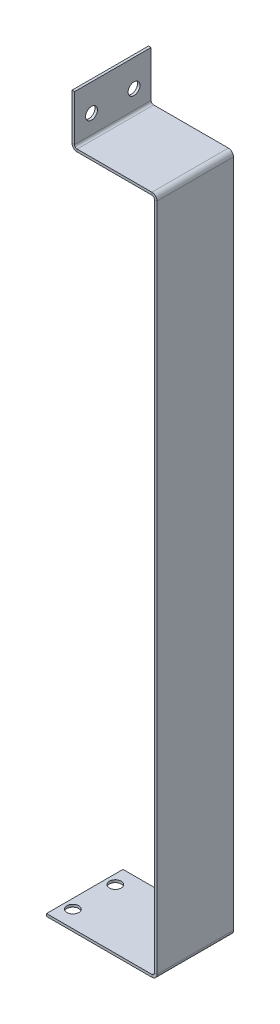
ISO-10303-21;
HEADER;
FILE_DESCRIPTION(('STEP AP214'),'2;1');
FILE_NAME('part.step','',(''),(''),'','','');
FILE_SCHEMA(('AUTOMOTIVE_DESIGN { 1 0 10303 214 1 1 1 1 }'));
ENDSEC;
DATA;
#1=APPLICATION_CONTEXT('core data for automotive mechanical design processes');
#2=APPLICATION_PROTOCOL_DEFINITION('international standard','automotive_design',2000,#1);
#3=PRODUCT_CONTEXT('',#1,'mechanical');
#4=PRODUCT('Part','Part','',(#3));
#5=PRODUCT_RELATED_PRODUCT_CATEGORY('part','',(#4));
#6=PRODUCT_DEFINITION_FORMATION('','',#4);
#7=PRODUCT_DEFINITION_CONTEXT('part definition',#1,'design');
#8=PRODUCT_DEFINITION('design','',#6,#7);
#9=PRODUCT_DEFINITION_SHAPE('','',#8);
#10=(LENGTH_UNIT() NAMED_UNIT(*) SI_UNIT(.MILLI.,.METRE.));
#11=(NAMED_UNIT(*) PLANE_ANGLE_UNIT() SI_UNIT($,.RADIAN.));
#12=(NAMED_UNIT(*) SI_UNIT($,.STERADIAN.) SOLID_ANGLE_UNIT());
#13=UNCERTAINTY_MEASURE_WITH_UNIT(LENGTH_MEASURE(1.E-05),#10,'distance_accuracy_value','');
#14=(GEOMETRIC_REPRESENTATION_CONTEXT(3) GLOBAL_UNCERTAINTY_ASSIGNED_CONTEXT((#13)) GLOBAL_UNIT_ASSIGNED_CONTEXT((#10,
#11,#12)) REPRESENTATION_CONTEXT('',''));
#15=CARTESIAN_POINT('',(0.,0.,0.));
#16=DIRECTION('',(0.,0.,1.));
#17=DIRECTION('',(1.,0.,0.));
#18=AXIS2_PLACEMENT_3D('',#15,#16,#17);
#19=CARTESIAN_POINT('',(-48.5,401.5,-45.));
#20=DIRECTION('',(0.,0.,-1.));
#21=DIRECTION('',(-1.,0.,0.));
#22=AXIS2_PLACEMENT_3D('',#19,#20,#21);
#23=PLANE('',#22);
#24=DIRECTION('',(-1.,0.,0.));
#25=VECTOR('',#24,1.);
#26=CARTESIAN_POINT('',(-48.5,401.5,-45.));
#27=LINE('',#26,#25);
#28=CARTESIAN_POINT('',(-48.5,401.5,-45.));
#29=VERTEX_POINT('',#28);
#30=CARTESIAN_POINT('',(-50.,401.5,-45.));
#31=VERTEX_POINT('',#30);
#32=EDGE_CURVE('E11',#29,#31,#27,.T.);
#33=ORIENTED_EDGE('',*,*,#32,.F.);
#34=CARTESIAN_POINT('',(-47.,401.5,-45.));
#35=DIRECTION('',(0.,0.,-1.));
#36=DIRECTION('',(-1.,0.,0.));
#37=AXIS2_PLACEMENT_3D('',#34,#35,#36);
#38=CIRCLE('',#37,1.5);
#39=CARTESIAN_POINT('',(-47.,400.,-45.));
#40=VERTEX_POINT('',#39);
#41=EDGE_CURVE('E347',#29,#40,#38,.F.);
#42=ORIENTED_EDGE('',*,*,#41,.T.);
#43=DIRECTION('',(0.,1.,0.));
#44=VECTOR('',#43,1.);
#45=CARTESIAN_POINT('',(-47.,398.5,-45.));
#46=LINE('',#45,#44);
#47=CARTESIAN_POINT('',(-47.,398.5,-45.));
#48=VERTEX_POINT('',#47);
#49=EDGE_CURVE('E54',#48,#40,#46,.T.);
#50=ORIENTED_EDGE('',*,*,#49,.F.);
#51=CARTESIAN_POINT('',(-47.,401.5,-45.));
#52=DIRECTION('',(0.,0.,1.));
#53=DIRECTION('',(1.,0.,0.));
#54=AXIS2_PLACEMENT_3D('',#51,#52,#53);
#55=CIRCLE('',#54,3.);
#56=EDGE_CURVE('E210',#31,#48,#55,.T.);
#57=ORIENTED_EDGE('',*,*,#56,.F.);
#58=EDGE_LOOP('',(#33,#42,#50,#57));
#59=FACE_BOUND('',#58,.T.);
#60=ADVANCED_FACE('F45',(#59),#23,.T.);
#61=CARTESIAN_POINT('',(-47.,398.5,-45.));
#62=DIRECTION('',(0.,0.,-1.));
#63=DIRECTION('',(-1.,0.,0.));
#64=AXIS2_PLACEMENT_3D('',#61,#62,#63);
#65=PLANE('',#64);
#66=DIRECTION('',(0.,-1.,0.));
#67=VECTOR('',#66,1.);
#68=CARTESIAN_POINT('',(-48.5,428.5,-45.));
#69=LINE('',#68,#67);
#70=CARTESIAN_POINT('',(-48.5,428.5,-45.));
#71=VERTEX_POINT('',#70);
#72=EDGE_CURVE('E350',#71,#29,#69,.T.);
#73=ORIENTED_EDGE('',*,*,#72,.T.);
#74=ORIENTED_EDGE('',*,*,#32,.T.);
#75=DIRECTION('',(0.,-1.,0.));
#76=VECTOR('',#75,1.);
#77=CARTESIAN_POINT('',(-50.,428.5,-45.));
#78=LINE('',#77,#76);
#79=CARTESIAN_POINT('',(-50.,428.5,-45.));
#80=VERTEX_POINT('',#79);
#81=EDGE_CURVE('E355',#80,#31,#78,.T.);
#82=ORIENTED_EDGE('',*,*,#81,.F.);
#83=DIRECTION('',(1.,0.,0.));
#84=VECTOR('',#83,1.);
#85=CARTESIAN_POINT('',(-50.,428.5,-45.));
#86=LINE('',#85,#84);
#87=EDGE_CURVE('E353',#80,#71,#86,.T.);
#88=ORIENTED_EDGE('',*,*,#87,.T.);
#89=EDGE_LOOP('',(#73,#74,#82,#88));
#90=FACE_BOUND('',#89,.T.);
#91=ADVANCED_FACE('F372',(#90),#65,.T.);
#92=CARTESIAN_POINT('',(-47.,400.,0.));
#93=DIRECTION('',(0.,0.,1.));
#94=DIRECTION('',(1.,0.,0.));
#95=AXIS2_PLACEMENT_3D('',#92,#93,#94);
#96=PLANE('',#95);
#97=DIRECTION('',(0.,-1.,0.));
#98=VECTOR('',#97,1.);
#99=CARTESIAN_POINT('',(-47.,400.,0.));
#100=LINE('',#99,#98);
#101=CARTESIAN_POINT('',(-47.,400.,0.));
#102=VERTEX_POINT('',#101);
#103=CARTESIAN_POINT('',(-47.,398.5,0.));
#104=VERTEX_POINT('',#103);
#105=EDGE_CURVE('E307',#102,#104,#100,.T.);
#106=ORIENTED_EDGE('',*,*,#105,.F.);
#107=CARTESIAN_POINT('',(-47.,401.5,0.));
#108=DIRECTION('',(0.,0.,-1.));
#109=DIRECTION('',(-1.,0.,0.));
#110=AXIS2_PLACEMENT_3D('',#107,#108,#109);
#111=CIRCLE('',#110,1.5);
#112=CARTESIAN_POINT('',(-48.5,401.5,0.));
#113=VERTEX_POINT('',#112);
#114=EDGE_CURVE('E237',#113,#102,#111,.F.);
#115=ORIENTED_EDGE('',*,*,#114,.F.);
#116=DIRECTION('',(1.,0.,0.));
#117=VECTOR('',#116,1.);
#118=CARTESIAN_POINT('',(-50.,401.5,0.));
#119=LINE('',#118,#117);
#120=CARTESIAN_POINT('',(-50.,401.5,0.));
#121=VERTEX_POINT('',#120);
#122=EDGE_CURVE('E305',#121,#113,#119,.T.);
#123=ORIENTED_EDGE('',*,*,#122,.F.);
#124=CARTESIAN_POINT('',(-47.,401.5,0.));
#125=DIRECTION('',(0.,0.,1.));
#126=DIRECTION('',(1.,0.,0.));
#127=AXIS2_PLACEMENT_3D('',#124,#125,#126);
#128=CIRCLE('',#127,3.);
#129=EDGE_CURVE('E248',#121,#104,#128,.T.);
#130=ORIENTED_EDGE('',*,*,#129,.T.);
#131=EDGE_LOOP('',(#106,#115,#123,#130));
#132=FACE_BOUND('',#131,.T.);
#133=ADVANCED_FACE('F396',(#132),#96,.T.);
#134=CARTESIAN_POINT('',(-50.,401.5,0.));
#135=DIRECTION('',(0.,0.,1.));
#136=DIRECTION('',(1.,0.,0.));
#137=AXIS2_PLACEMENT_3D('',#134,#135,#136);
#138=PLANE('',#137);
#139=DIRECTION('',(1.,0.,0.));
#140=VECTOR('',#139,1.);
#141=CARTESIAN_POINT('',(-48.5,400.,0.));
#142=LINE('',#141,#140);
#143=CARTESIAN_POINT('',(-3.,400.,0.));
#144=VERTEX_POINT('',#143);
#145=EDGE_CURVE('E234',#102,#144,#142,.T.);
#146=ORIENTED_EDGE('',*,*,#145,.F.);
#147=ORIENTED_EDGE('',*,*,#105,.T.);
#148=DIRECTION('',(1.,0.,0.));
#149=VECTOR('',#148,1.);
#150=CARTESIAN_POINT('',(-48.5,398.5,0.));
#151=LINE('',#150,#149);
#152=CARTESIAN_POINT('',(-2.99999999999999,398.5,0.));
#153=VERTEX_POINT('',#152);
#154=EDGE_CURVE('E251',#104,#153,#151,.T.);
#155=ORIENTED_EDGE('',*,*,#154,.T.);
#156=DIRECTION('',(0.,1.,0.));
#157=VECTOR('',#156,1.);
#158=CARTESIAN_POINT('',(-2.99999999999999,398.5,0.));
#159=LINE('',#158,#157);
#160=EDGE_CURVE('E301',#153,#144,#159,.T.);
#161=ORIENTED_EDGE('',*,*,#160,.T.);
#162=EDGE_LOOP('',(#146,#147,#155,#161));
#163=FACE_BOUND('',#162,.T.);
#164=ADVANCED_FACE('F421',(#163),#138,.T.);
#165=CARTESIAN_POINT('',(-3.,400.,-45.));
#166=DIRECTION('',(0.,0.,-1.));
#167=DIRECTION('',(-1.,0.,0.));
#168=AXIS2_PLACEMENT_3D('',#165,#166,#167);
#169=PLANE('',#168);
#170=DIRECTION('',(0.,-1.,0.));
#171=VECTOR('',#170,1.);
#172=CARTESIAN_POINT('',(-3.,400.,-45.));
#173=LINE('',#172,#171);
#174=CARTESIAN_POINT('',(-3.,400.,-45.));
#175=VERTEX_POINT('',#174);
#176=CARTESIAN_POINT('',(-2.99999999999999,398.5,-45.));
#177=VERTEX_POINT('',#176);
#178=EDGE_CURVE('E182',#175,#177,#173,.T.);
#179=ORIENTED_EDGE('',*,*,#178,.F.);
#180=CARTESIAN_POINT('',(-2.99999999999999,397.,-45.));
#181=DIRECTION('',(0.,0.,1.));
#182=DIRECTION('',(1.,0.,0.));
#183=AXIS2_PLACEMENT_3D('',#180,#181,#182);
#184=CIRCLE('',#183,3.);
#185=CARTESIAN_POINT('',(0.,397.,-45.));
#186=VERTEX_POINT('',#185);
#187=EDGE_CURVE('E177',#175,#186,#184,.F.);
#188=ORIENTED_EDGE('',*,*,#187,.T.);
#189=DIRECTION('',(1.,0.,0.));
#190=VECTOR('',#189,1.);
#191=CARTESIAN_POINT('',(-1.49999999999999,397.,-45.));
#192=LINE('',#191,#190);
#193=CARTESIAN_POINT('',(-1.49999999999999,397.,-45.));
#194=VERTEX_POINT('',#193);
#195=EDGE_CURVE('E170',#194,#186,#192,.T.);
#196=ORIENTED_EDGE('',*,*,#195,.F.);
#197=CARTESIAN_POINT('',(-2.99999999999999,397.,-45.));
#198=DIRECTION('',(0.,0.,1.));
#199=DIRECTION('',(1.,0.,0.));
#200=AXIS2_PLACEMENT_3D('',#197,#198,#199);
#201=CIRCLE('',#200,1.5);
#202=EDGE_CURVE('E174',#177,#194,#201,.F.);
#203=ORIENTED_EDGE('',*,*,#202,.F.);
#204=EDGE_LOOP('',(#179,#188,#196,#203));
#205=FACE_BOUND('',#204,.T.);
#206=ADVANCED_FACE('F172',(#205),#169,.T.);
#207=CARTESIAN_POINT('',(-1.49999999999999,397.,-45.));
#208=DIRECTION('',(0.,0.,-1.));
#209=DIRECTION('',(-1.,0.,0.));
#210=AXIS2_PLACEMENT_3D('',#207,#208,#209);
#211=PLANE('',#210);
#212=DIRECTION('',(1.,0.,0.));
#213=VECTOR('',#212,1.);
#214=CARTESIAN_POINT('',(-48.5,400.,-45.));
#215=LINE('',#214,#213);
#216=EDGE_CURVE('E344',#40,#175,#215,.T.);
#217=ORIENTED_EDGE('',*,*,#216,.T.);
#218=ORIENTED_EDGE('',*,*,#178,.T.);
#219=DIRECTION('',(1.,0.,0.));
#220=VECTOR('',#219,1.);
#221=CARTESIAN_POINT('',(-48.5,398.5,-45.));
#222=LINE('',#221,#220);
#223=EDGE_CURVE('E208',#48,#177,#222,.T.);
#224=ORIENTED_EDGE('',*,*,#223,.F.);
#225=ORIENTED_EDGE('',*,*,#49,.T.);
#226=EDGE_LOOP('',(#217,#218,#224,#225));
#227=FACE_BOUND('',#226,.T.);
#228=ADVANCED_FACE('F390',(#227),#211,.T.);
#229=CARTESIAN_POINT('',(0.,397.,0.));
#230=DIRECTION('',(0.,0.,1.));
#231=DIRECTION('',(1.,0.,0.));
#232=AXIS2_PLACEMENT_3D('',#229,#230,#231);
#233=PLANE('',#232);
#234=DIRECTION('',(-1.,0.,0.));
#235=VECTOR('',#234,1.);
#236=CARTESIAN_POINT('',(0.,397.,0.));
#237=LINE('',#236,#235);
#238=CARTESIAN_POINT('',(0.,397.,0.));
#239=VERTEX_POINT('',#238);
#240=CARTESIAN_POINT('',(-1.49999999999999,397.,0.));
#241=VERTEX_POINT('',#240);
#242=EDGE_CURVE('E183',#239,#241,#237,.T.);
#243=ORIENTED_EDGE('',*,*,#242,.F.);
#244=CARTESIAN_POINT('',(-2.99999999999999,397.,0.));
#245=DIRECTION('',(0.,0.,1.));
#246=DIRECTION('',(1.,0.,0.));
#247=AXIS2_PLACEMENT_3D('',#244,#245,#246);
#248=CIRCLE('',#247,3.);
#249=EDGE_CURVE('E231',#144,#239,#248,.F.);
#250=ORIENTED_EDGE('',*,*,#249,.F.);
#251=ORIENTED_EDGE('',*,*,#160,.F.);
#252=CARTESIAN_POINT('',(-2.99999999999999,397.,0.));
#253=DIRECTION('',(0.,0.,1.));
#254=DIRECTION('',(1.,0.,0.));
#255=AXIS2_PLACEMENT_3D('',#252,#253,#254);
#256=CIRCLE('',#255,1.5);
#257=EDGE_CURVE('E254',#153,#241,#256,.F.);
#258=ORIENTED_EDGE('',*,*,#257,.T.);
#259=EDGE_LOOP('',(#243,#250,#251,#258));
#260=FACE_BOUND('',#259,.T.);
#261=ADVANCED_FACE('F430',(#260),#233,.T.);
#262=CARTESIAN_POINT('',(-2.99999999999999,398.5,0.));
#263=DIRECTION('',(0.,0.,1.));
#264=DIRECTION('',(1.,0.,0.));
#265=AXIS2_PLACEMENT_3D('',#262,#263,#264);
#266=PLANE('',#265);
#267=DIRECTION('',(0.,-1.,0.));
#268=VECTOR('',#267,1.);
#269=CARTESIAN_POINT('',(0.,400.,0.));
#270=LINE('',#269,#268);
#271=CARTESIAN_POINT('',(0.,3.,0.));
#272=VERTEX_POINT('',#271);
#273=EDGE_CURVE('E228',#239,#272,#270,.T.);
#274=ORIENTED_EDGE('',*,*,#273,.F.);
#275=ORIENTED_EDGE('',*,*,#242,.T.);
#276=DIRECTION('',(0.,-1.,0.));
#277=VECTOR('',#276,1.);
#278=CARTESIAN_POINT('',(-1.49999999999999,400.,0.));
#279=LINE('',#278,#277);
#280=CARTESIAN_POINT('',(-1.5,3.,0.));
#281=VERTEX_POINT('',#280);
#282=EDGE_CURVE('E193',#241,#281,#279,.T.);
#283=ORIENTED_EDGE('',*,*,#282,.T.);
#284=DIRECTION('',(1.,0.,0.));
#285=VECTOR('',#284,1.);
#286=CARTESIAN_POINT('',(-1.5,3.,0.));
#287=LINE('',#286,#285);
#288=EDGE_CURVE('E116',#281,#272,#287,.T.);
#289=ORIENTED_EDGE('',*,*,#288,.T.);
#290=EDGE_LOOP('',(#274,#275,#283,#289));
#291=FACE_BOUND('',#290,.T.);
#292=ADVANCED_FACE('F433',(#291),#266,.T.);
#293=CARTESIAN_POINT('',(0.,3.,-45.));
#294=DIRECTION('',(0.,0.,-1.));
#295=DIRECTION('',(-1.,0.,0.));
#296=AXIS2_PLACEMENT_3D('',#293,#294,#295);
#297=PLANE('',#296);
#298=DIRECTION('',(-1.,0.,0.));
#299=VECTOR('',#298,1.);
#300=CARTESIAN_POINT('',(0.,3.,-45.));
#301=LINE('',#300,#299);
#302=CARTESIAN_POINT('',(0.,3.,-45.));
#303=VERTEX_POINT('',#302);
#304=CARTESIAN_POINT('',(-1.5,3.,-45.));
#305=VERTEX_POINT('',#304);
#306=EDGE_CURVE('E201',#303,#305,#301,.T.);
#307=ORIENTED_EDGE('',*,*,#306,.F.);
#308=CARTESIAN_POINT('',(-3.,3.,-45.));
#309=DIRECTION('',(0.,0.,1.));
#310=DIRECTION('',(1.,0.,0.));
#311=AXIS2_PLACEMENT_3D('',#308,#309,#310);
#312=CIRCLE('',#311,3.);
#313=CARTESIAN_POINT('',(-3.,0.,-45.));
#314=VERTEX_POINT('',#313);
#315=EDGE_CURVE('E339',#303,#314,#312,.F.);
#316=ORIENTED_EDGE('',*,*,#315,.T.);
#317=DIRECTION('',(0.,-1.,0.));
#318=VECTOR('',#317,1.);
#319=CARTESIAN_POINT('',(-3.,1.5,-45.));
#320=LINE('',#319,#318);
#321=CARTESIAN_POINT('',(-3.,1.5,-45.));
#322=VERTEX_POINT('',#321);
#323=EDGE_CURVE('E63',#322,#314,#320,.T.);
#324=ORIENTED_EDGE('',*,*,#323,.F.);
#325=CARTESIAN_POINT('',(-3.,3.,-45.));
#326=DIRECTION('',(0.,0.,1.));
#327=DIRECTION('',(1.,0.,0.));
#328=AXIS2_PLACEMENT_3D('',#325,#326,#327);
#329=CIRCLE('',#328,1.5);
#330=EDGE_CURVE('E203',#305,#322,#329,.F.);
#331=ORIENTED_EDGE('',*,*,#330,.F.);
#332=EDGE_LOOP('',(#307,#316,#324,#331));
#333=FACE_BOUND('',#332,.T.);
#334=ADVANCED_FACE('F437',(#333),#297,.T.);
#335=CARTESIAN_POINT('',(-3.,1.5,-45.));
#336=DIRECTION('',(0.,0.,-1.));
#337=DIRECTION('',(-1.,0.,0.));
#338=AXIS2_PLACEMENT_3D('',#335,#336,#337);
#339=PLANE('',#338);
#340=DIRECTION('',(0.,-1.,0.));
#341=VECTOR('',#340,1.);
#342=CARTESIAN_POINT('',(0.,400.,-45.));
#343=LINE('',#342,#341);
#344=EDGE_CURVE('E341',#186,#303,#343,.T.);
#345=ORIENTED_EDGE('',*,*,#344,.T.);
#346=ORIENTED_EDGE('',*,*,#306,.T.);
#347=DIRECTION('',(0.,-1.,0.));
#348=VECTOR('',#347,1.);
#349=CARTESIAN_POINT('',(-1.49999999999999,400.,-45.));
#350=LINE('',#349,#348);
#351=EDGE_CURVE('E191',#194,#305,#350,.T.);
#352=ORIENTED_EDGE('',*,*,#351,.F.);
#353=ORIENTED_EDGE('',*,*,#195,.T.);
#354=EDGE_LOOP('',(#345,#346,#352,#353));
#355=FACE_BOUND('',#354,.T.);
#356=ADVANCED_FACE('F200',(#355),#339,.T.);
#357=CARTESIAN_POINT('',(-3.,0.,0.));
#358=DIRECTION('',(0.,0.,1.));
#359=DIRECTION('',(1.,0.,0.));
#360=AXIS2_PLACEMENT_3D('',#357,#358,#359);
#361=PLANE('',#360);
#362=DIRECTION('',(0.,1.,0.));
#363=VECTOR('',#362,1.);
#364=CARTESIAN_POINT('',(-3.,0.,0.));
#365=LINE('',#364,#363);
#366=CARTESIAN_POINT('',(-3.,0.,0.));
#367=VERTEX_POINT('',#366);
#368=CARTESIAN_POINT('',(-3.,1.5,0.));
#369=VERTEX_POINT('',#368);
#370=EDGE_CURVE('E123',#367,#369,#365,.T.);
#371=ORIENTED_EDGE('',*,*,#370,.F.);
#372=CARTESIAN_POINT('',(-3.,3.,0.));
#373=DIRECTION('',(0.,0.,1.));
#374=DIRECTION('',(1.,0.,0.));
#375=AXIS2_PLACEMENT_3D('',#372,#373,#374);
#376=CIRCLE('',#375,3.);
#377=EDGE_CURVE('E225',#272,#367,#376,.F.);
#378=ORIENTED_EDGE('',*,*,#377,.F.);
#379=ORIENTED_EDGE('',*,*,#288,.F.);
#380=CARTESIAN_POINT('',(-3.,3.,0.));
#381=DIRECTION('',(0.,0.,1.));
#382=DIRECTION('',(1.,0.,0.));
#383=AXIS2_PLACEMENT_3D('',#380,#381,#382);
#384=CIRCLE('',#383,1.5);
#385=EDGE_CURVE('E257',#281,#369,#384,.F.);
#386=ORIENTED_EDGE('',*,*,#385,.T.);
#387=EDGE_LOOP('',(#371,#378,#379,#386));
#388=FACE_BOUND('',#387,.T.);
#389=ADVANCED_FACE('F443',(#388),#361,.T.);
#390=CARTESIAN_POINT('',(-1.5,3.,0.));
#391=DIRECTION('',(0.,0.,1.));
#392=DIRECTION('',(1.,0.,0.));
#393=AXIS2_PLACEMENT_3D('',#390,#391,#392);
#394=PLANE('',#393);
#395=DIRECTION('',(-1.,0.,0.));
#396=VECTOR('',#395,1.);
#397=CARTESIAN_POINT('',(0.,0.,0.));
#398=LINE('',#397,#396);
#399=CARTESIAN_POINT('',(-64.9999999999999,0.,0.));
#400=VERTEX_POINT('',#399);
#401=EDGE_CURVE('E223',#367,#400,#398,.T.);
#402=ORIENTED_EDGE('',*,*,#401,.F.);
#403=ORIENTED_EDGE('',*,*,#370,.T.);
#404=DIRECTION('',(-1.,0.,0.));
#405=VECTOR('',#404,1.);
#406=CARTESIAN_POINT('',(0.,1.5,0.));
#407=LINE('',#406,#405);
#408=CARTESIAN_POINT('',(-64.9999999999999,1.5,0.));
#409=VERTEX_POINT('',#408);
#410=EDGE_CURVE('E217',#369,#409,#407,.T.);
#411=ORIENTED_EDGE('',*,*,#410,.T.);
#412=DIRECTION('',(0.,1.,0.));
#413=VECTOR('',#412,1.);
#414=CARTESIAN_POINT('',(-64.9999999999999,0.,0.));
#415=LINE('',#414,#413);
#416=EDGE_CURVE('E219',#400,#409,#415,.T.);
#417=ORIENTED_EDGE('',*,*,#416,.F.);
#418=EDGE_LOOP('',(#402,#403,#411,#417));
#419=FACE_BOUND('',#418,.T.);
#420=ADVANCED_FACE('F446',(#419),#394,.T.);
#421=CARTESIAN_POINT('',(0.,1.5,-45.));
#422=DIRECTION('',(0.,1.,0.));
#423=DIRECTION('',(-1.,0.,0.));
#424=AXIS2_PLACEMENT_3D('',#421,#422,#423);
#425=PLANE('',#424);
#426=CARTESIAN_POINT('',(-59.5,1.49999999999999,-35.));
#427=DIRECTION('',(0.,1.,0.));
#428=DIRECTION('',(-1.,0.,0.));
#429=AXIS2_PLACEMENT_3D('',#426,#427,#428);
#430=CIRCLE('',#429,3.50000000000001);
#431=CARTESIAN_POINT('',(-63.,1.49999999999999,-35.));
#432=VERTEX_POINT('',#431);
#433=EDGE_CURVE('E313',#432,#432,#430,.T.);
#434=ORIENTED_EDGE('',*,*,#433,.F.);
#435=EDGE_LOOP('',(#434));
#436=FACE_BOUND('',#435,.T.);
#437=CARTESIAN_POINT('',(-59.5,1.49999999999999,-10.));
#438=DIRECTION('',(0.,1.,0.));
#439=DIRECTION('',(-1.,0.,0.));
#440=AXIS2_PLACEMENT_3D('',#437,#438,#439);
#441=CIRCLE('',#440,3.50000000000001);
#442=CARTESIAN_POINT('',(-63.,1.49999999999999,-10.));
#443=VERTEX_POINT('',#442);
#444=EDGE_CURVE('E321',#443,#443,#441,.T.);
#445=ORIENTED_EDGE('',*,*,#444,.F.);
#446=EDGE_LOOP('',(#445));
#447=FACE_BOUND('',#446,.T.);
#448=ORIENTED_EDGE('',*,*,#410,.F.);
#449=DIRECTION('',(0.,0.,1.));
#450=VECTOR('',#449,1.);
#451=CARTESIAN_POINT('',(-3.,1.5,-45.));
#452=LINE('',#451,#450);
#453=EDGE_CURVE('E260',#322,#369,#452,.T.);
#454=ORIENTED_EDGE('',*,*,#453,.F.);
#455=DIRECTION('',(-1.,0.,0.));
#456=VECTOR('',#455,1.);
#457=CARTESIAN_POINT('',(0.,1.5,-45.));
#458=LINE('',#457,#456);
#459=CARTESIAN_POINT('',(-64.9999999999999,1.5,-45.));
#460=VERTEX_POINT('',#459);
#461=EDGE_CURVE('E259',#322,#460,#458,.T.);
#462=ORIENTED_EDGE('',*,*,#461,.T.);
#463=DIRECTION('',(0.,0.,1.));
#464=VECTOR('',#463,1.);
#465=CARTESIAN_POINT('',(-64.9999999999999,1.5,-45.));
#466=LINE('',#465,#464);
#467=EDGE_CURVE('E216',#460,#409,#466,.T.);
#468=ORIENTED_EDGE('',*,*,#467,.T.);
#469=EDGE_LOOP('',(#448,#454,#462,#468));
#470=FACE_BOUND('',#469,.T.);
#471=ADVANCED_FACE('F449',(#436,#447,#470),#425,.T.);
#472=CARTESIAN_POINT('',(-3.,3.,-45.));
#473=DIRECTION('',(0.,0.,1.));
#474=DIRECTION('',(1.,0.,0.));
#475=AXIS2_PLACEMENT_3D('',#472,#473,#474);
#476=CYLINDRICAL_SURFACE('',#475,1.5);
#477=ORIENTED_EDGE('',*,*,#385,.F.);
#478=DIRECTION('',(0.,0.,1.));
#479=VECTOR('',#478,1.);
#480=CARTESIAN_POINT('',(-1.5,3.,-45.));
#481=LINE('',#480,#479);
#482=EDGE_CURVE('E197',#305,#281,#481,.T.);
#483=ORIENTED_EDGE('',*,*,#482,.F.);
#484=ORIENTED_EDGE('',*,*,#330,.T.);
#485=ORIENTED_EDGE('',*,*,#453,.T.);
#486=EDGE_LOOP('',(#477,#483,#484,#485));
#487=FACE_BOUND('',#486,.T.);
#488=ADVANCED_FACE('F452',(#487),#476,.F.);
#489=CARTESIAN_POINT('',(-1.49999999999999,400.,-45.));
#490=DIRECTION('',(-1.,0.,0.));
#491=DIRECTION('',(0.,-1.,0.));
#492=AXIS2_PLACEMENT_3D('',#489,#490,#491);
#493=PLANE('',#492);
#494=ORIENTED_EDGE('',*,*,#282,.F.);
#495=DIRECTION('',(0.,0.,1.));
#496=VECTOR('',#495,1.);
#497=CARTESIAN_POINT('',(-1.49999999999999,397.,-45.));
#498=LINE('',#497,#496);
#499=EDGE_CURVE('E189',#194,#241,#498,.T.);
#500=ORIENTED_EDGE('',*,*,#499,.F.);
#501=ORIENTED_EDGE('',*,*,#351,.T.);
#502=ORIENTED_EDGE('',*,*,#482,.T.);
#503=EDGE_LOOP('',(#494,#500,#501,#502));
#504=FACE_BOUND('',#503,.T.);
#505=ADVANCED_FACE('F190',(#504),#493,.T.);
#506=CARTESIAN_POINT('',(-2.99999999999999,397.,-45.));
#507=DIRECTION('',(0.,0.,1.));
#508=DIRECTION('',(1.,0.,0.));
#509=AXIS2_PLACEMENT_3D('',#506,#507,#508);
#510=CYLINDRICAL_SURFACE('',#509,1.5);
#511=ORIENTED_EDGE('',*,*,#257,.F.);
#512=DIRECTION('',(0.,0.,1.));
#513=VECTOR('',#512,1.);
#514=CARTESIAN_POINT('',(-2.99999999999999,398.5,-45.));
#515=LINE('',#514,#513);
#516=EDGE_CURVE('E198',#177,#153,#515,.T.);
#517=ORIENTED_EDGE('',*,*,#516,.F.);
#518=ORIENTED_EDGE('',*,*,#202,.T.);
#519=ORIENTED_EDGE('',*,*,#499,.T.);
#520=EDGE_LOOP('',(#511,#517,#518,#519));
#521=FACE_BOUND('',#520,.T.);
#522=ADVANCED_FACE('F206',(#521),#510,.F.);
#523=CARTESIAN_POINT('',(-48.5,398.5,-45.));
#524=DIRECTION('',(0.,-1.,0.));
#525=DIRECTION('',(0.,0.,-1.));
#526=AXIS2_PLACEMENT_3D('',#523,#524,#525);
#527=PLANE('',#526);
#528=ORIENTED_EDGE('',*,*,#154,.F.);
#529=DIRECTION('',(0.,0.,1.));
#530=VECTOR('',#529,1.);
#531=CARTESIAN_POINT('',(-47.,398.5,-45.));
#532=LINE('',#531,#530);
#533=EDGE_CURVE('E264',#48,#104,#532,.T.);
#534=ORIENTED_EDGE('',*,*,#533,.F.);
#535=ORIENTED_EDGE('',*,*,#223,.T.);
#536=ORIENTED_EDGE('',*,*,#516,.T.);
#537=EDGE_LOOP('',(#528,#534,#535,#536));
#538=FACE_BOUND('',#537,.T.);
#539=ADVANCED_FACE('F393',(#538),#527,.T.);
#540=CARTESIAN_POINT('',(-47.,401.5,-45.));
#541=DIRECTION('',(0.,0.,1.));
#542=DIRECTION('',(1.,0.,0.));
#543=AXIS2_PLACEMENT_3D('',#540,#541,#542);
#544=CYLINDRICAL_SURFACE('',#543,3.);
#545=ORIENTED_EDGE('',*,*,#129,.F.);
#546=DIRECTION('',(0.,0.,1.));
#547=VECTOR('',#546,1.);
#548=CARTESIAN_POINT('',(-50.,401.5,-45.));
#549=LINE('',#548,#547);
#550=EDGE_CURVE('E267',#31,#121,#549,.T.);
#551=ORIENTED_EDGE('',*,*,#550,.F.);
#552=ORIENTED_EDGE('',*,*,#56,.T.);
#553=ORIENTED_EDGE('',*,*,#533,.T.);
#554=EDGE_LOOP('',(#545,#551,#552,#553));
#555=FACE_BOUND('',#554,.T.);
#556=ADVANCED_FACE('F362',(#555),#544,.T.);
#557=CARTESIAN_POINT('',(-50.,428.5,-45.));
#558=DIRECTION('',(-1.,0.,0.));
#559=DIRECTION('',(0.,-1.,0.));
#560=AXIS2_PLACEMENT_3D('',#557,#558,#559);
#561=PLANE('',#560);
#562=CARTESIAN_POINT('',(-50.0000000000001,412.5,-35.));
#563=DIRECTION('',(-1.,0.,0.));
#564=DIRECTION('',(0.,0.,1.));
#565=AXIS2_PLACEMENT_3D('',#562,#563,#564);
#566=CIRCLE('',#565,3.5);
#567=CARTESIAN_POINT('',(-50.0000000000001,412.5,-31.5));
#568=VERTEX_POINT('',#567);
#569=EDGE_CURVE('E317',#568,#568,#566,.T.);
#570=ORIENTED_EDGE('',*,*,#569,.F.);
#571=EDGE_LOOP('',(#570));
#572=FACE_BOUND('',#571,.T.);
#573=CARTESIAN_POINT('',(-50.0000000000001,412.5,-9.99999999999999));
#574=DIRECTION('',(-1.,0.,0.));
#575=DIRECTION('',(0.,0.,1.));
#576=AXIS2_PLACEMENT_3D('',#573,#574,#575);
#577=CIRCLE('',#576,3.5);
#578=CARTESIAN_POINT('',(-50.0000000000001,412.5,-6.49999999999999));
#579=VERTEX_POINT('',#578);
#580=EDGE_CURVE('E323',#579,#579,#577,.T.);
#581=ORIENTED_EDGE('',*,*,#580,.F.);
#582=EDGE_LOOP('',(#581));
#583=FACE_BOUND('',#582,.T.);
#584=DIRECTION('',(0.,-1.,0.));
#585=VECTOR('',#584,1.);
#586=CARTESIAN_POINT('',(-50.,428.5,0.));
#587=LINE('',#586,#585);
#588=CARTESIAN_POINT('',(-50.,428.5,0.));
#589=VERTEX_POINT('',#588);
#590=EDGE_CURVE('E245',#589,#121,#587,.T.);
#591=ORIENTED_EDGE('',*,*,#590,.F.);
#592=DIRECTION('',(0.,0.,1.));
#593=VECTOR('',#592,1.);
#594=CARTESIAN_POINT('',(-50.,428.5,-45.));
#595=LINE('',#594,#593);
#596=EDGE_CURVE('E270',#80,#589,#595,.T.);
#597=ORIENTED_EDGE('',*,*,#596,.F.);
#598=ORIENTED_EDGE('',*,*,#81,.T.);
#599=ORIENTED_EDGE('',*,*,#550,.T.);
#600=EDGE_LOOP('',(#591,#597,#598,#599));
#601=FACE_BOUND('',#600,.T.);
#602=ADVANCED_FACE('F369',(#572,#583,#601),#561,.T.);
#603=CARTESIAN_POINT('',(-50.,428.5,-45.));
#604=DIRECTION('',(0.,-1.,0.));
#605=DIRECTION('',(0.,0.,-1.));
#606=AXIS2_PLACEMENT_3D('',#603,#604,#605);
#607=PLANE('',#606);
#608=DIRECTION('',(1.,0.,0.));
#609=VECTOR('',#608,1.);
#610=CARTESIAN_POINT('',(-50.,428.5,0.));
#611=LINE('',#610,#609);
#612=CARTESIAN_POINT('',(-48.5,428.5,0.));
#613=VERTEX_POINT('',#612);
#614=EDGE_CURVE('E243',#589,#613,#611,.T.);
#615=ORIENTED_EDGE('',*,*,#614,.T.);
#616=DIRECTION('',(0.,0.,1.));
#617=VECTOR('',#616,1.);
#618=CARTESIAN_POINT('',(-48.5,428.5,-45.));
#619=LINE('',#618,#617);
#620=EDGE_CURVE('E272',#71,#613,#619,.T.);
#621=ORIENTED_EDGE('',*,*,#620,.F.);
#622=ORIENTED_EDGE('',*,*,#87,.F.);
#623=ORIENTED_EDGE('',*,*,#596,.T.);
#624=EDGE_LOOP('',(#615,#621,#622,#623));
#625=FACE_BOUND('',#624,.T.);
#626=ADVANCED_FACE('F401',(#625),#607,.F.);
#627=CARTESIAN_POINT('',(-48.5,428.5,-45.));
#628=DIRECTION('',(-1.,0.,0.));
#629=DIRECTION('',(0.,-1.,0.));
#630=AXIS2_PLACEMENT_3D('',#627,#628,#629);
#631=PLANE('',#630);
#632=CARTESIAN_POINT('',(-48.5,412.5,-35.));
#633=DIRECTION('',(-1.,0.,0.));
#634=DIRECTION('',(0.,-1.,0.));
#635=AXIS2_PLACEMENT_3D('',#632,#633,#634);
#636=CIRCLE('',#635,3.5);
#637=CARTESIAN_POINT('',(-48.5,409.,-35.));
#638=VERTEX_POINT('',#637);
#639=EDGE_CURVE('E48',#638,#638,#636,.T.);
#640=ORIENTED_EDGE('',*,*,#639,.T.);
#641=EDGE_LOOP('',(#640));
#642=FACE_BOUND('',#641,.T.);
#643=CARTESIAN_POINT('',(-48.5,412.5,-9.99999999999999));
#644=DIRECTION('',(-1.,0.,0.));
#645=DIRECTION('',(0.,-1.,0.));
#646=AXIS2_PLACEMENT_3D('',#643,#644,#645);
#647=CIRCLE('',#646,3.5);
#648=CARTESIAN_POINT('',(-48.5,409.,-9.99999999999999));
#649=VERTEX_POINT('',#648);
#650=EDGE_CURVE('E315',#649,#649,#647,.T.);
#651=ORIENTED_EDGE('',*,*,#650,.T.);
#652=EDGE_LOOP('',(#651));
#653=FACE_BOUND('',#652,.T.);
#654=DIRECTION('',(0.,-1.,0.));
#655=VECTOR('',#654,1.);
#656=CARTESIAN_POINT('',(-48.5,428.5,0.));
#657=LINE('',#656,#655);
#658=EDGE_CURVE('E240',#613,#113,#657,.T.);
#659=ORIENTED_EDGE('',*,*,#658,.T.);
#660=DIRECTION('',(0.,0.,1.));
#661=VECTOR('',#660,1.);
#662=CARTESIAN_POINT('',(-48.5,401.5,-45.));
#663=LINE('',#662,#661);
#664=EDGE_CURVE('E275',#29,#113,#663,.T.);
#665=ORIENTED_EDGE('',*,*,#664,.F.);
#666=ORIENTED_EDGE('',*,*,#72,.F.);
#667=ORIENTED_EDGE('',*,*,#620,.T.);
#668=EDGE_LOOP('',(#659,#665,#666,#667));
#669=FACE_BOUND('',#668,.T.);
#670=ADVANCED_FACE('F378',(#642,#653,#669),#631,.F.);
#671=CARTESIAN_POINT('',(-47.,401.5,-45.));
#672=DIRECTION('',(0.,0.,1.));
#673=DIRECTION('',(1.,0.,0.));
#674=AXIS2_PLACEMENT_3D('',#671,#672,#673);
#675=CYLINDRICAL_SURFACE('',#674,1.5);
#676=ORIENTED_EDGE('',*,*,#114,.T.);
#677=DIRECTION('',(0.,0.,1.));
#678=VECTOR('',#677,1.);
#679=CARTESIAN_POINT('',(-47.,400.,-45.));
#680=LINE('',#679,#678);
#681=EDGE_CURVE('E278',#40,#102,#680,.T.);
#682=ORIENTED_EDGE('',*,*,#681,.F.);
#683=ORIENTED_EDGE('',*,*,#41,.F.);
#684=ORIENTED_EDGE('',*,*,#664,.T.);
#685=EDGE_LOOP('',(#676,#682,#683,#684));
#686=FACE_BOUND('',#685,.T.);
#687=ADVANCED_FACE('F383',(#686),#675,.F.);
#688=CARTESIAN_POINT('',(-48.5,400.,-45.));
#689=DIRECTION('',(0.,-1.,0.));
#690=DIRECTION('',(0.,0.,-1.));
#691=AXIS2_PLACEMENT_3D('',#688,#689,#690);
#692=PLANE('',#691);
#693=ORIENTED_EDGE('',*,*,#145,.T.);
#694=DIRECTION('',(0.,0.,1.));
#695=VECTOR('',#694,1.);
#696=CARTESIAN_POINT('',(-3.,400.,-45.));
#697=LINE('',#696,#695);
#698=EDGE_CURVE('E281',#175,#144,#697,.T.);
#699=ORIENTED_EDGE('',*,*,#698,.F.);
#700=ORIENTED_EDGE('',*,*,#216,.F.);
#701=ORIENTED_EDGE('',*,*,#681,.T.);
#702=EDGE_LOOP('',(#693,#699,#700,#701));
#703=FACE_BOUND('',#702,.T.);
#704=ADVANCED_FACE('F388',(#703),#692,.F.);
#705=CARTESIAN_POINT('',(-2.99999999999999,397.,-45.));
#706=DIRECTION('',(0.,0.,1.));
#707=DIRECTION('',(1.,0.,0.));
#708=AXIS2_PLACEMENT_3D('',#705,#706,#707);
#709=CYLINDRICAL_SURFACE('',#708,3.);
#710=ORIENTED_EDGE('',*,*,#249,.T.);
#711=DIRECTION('',(0.,0.,1.));
#712=VECTOR('',#711,1.);
#713=CARTESIAN_POINT('',(0.,397.,-45.));
#714=LINE('',#713,#712);
#715=EDGE_CURVE('E284',#186,#239,#714,.T.);
#716=ORIENTED_EDGE('',*,*,#715,.F.);
#717=ORIENTED_EDGE('',*,*,#187,.F.);
#718=ORIENTED_EDGE('',*,*,#698,.T.);
#719=EDGE_LOOP('',(#710,#716,#717,#718));
#720=FACE_BOUND('',#719,.T.);
#721=ADVANCED_FACE('F470',(#720),#709,.T.);
#722=CARTESIAN_POINT('',(0.,400.,-45.));
#723=DIRECTION('',(-1.,0.,0.));
#724=DIRECTION('',(0.,-1.,0.));
#725=AXIS2_PLACEMENT_3D('',#722,#723,#724);
#726=PLANE('',#725);
#727=ORIENTED_EDGE('',*,*,#273,.T.);
#728=DIRECTION('',(0.,0.,1.));
#729=VECTOR('',#728,1.);
#730=CARTESIAN_POINT('',(0.,3.,-45.));
#731=LINE('',#730,#729);
#732=EDGE_CURVE('E287',#303,#272,#731,.T.);
#733=ORIENTED_EDGE('',*,*,#732,.F.);
#734=ORIENTED_EDGE('',*,*,#344,.F.);
#735=ORIENTED_EDGE('',*,*,#715,.T.);
#736=EDGE_LOOP('',(#727,#733,#734,#735));
#737=FACE_BOUND('',#736,.T.);
#738=ADVANCED_FACE('F466',(#737),#726,.F.);
#739=CARTESIAN_POINT('',(-3.,3.,-45.));
#740=DIRECTION('',(0.,0.,1.));
#741=DIRECTION('',(1.,0.,0.));
#742=AXIS2_PLACEMENT_3D('',#739,#740,#741);
#743=CYLINDRICAL_SURFACE('',#742,3.);
#744=ORIENTED_EDGE('',*,*,#377,.T.);
#745=DIRECTION('',(0.,0.,1.));
#746=VECTOR('',#745,1.);
#747=CARTESIAN_POINT('',(-3.,0.,-45.));
#748=LINE('',#747,#746);
#749=EDGE_CURVE('E290',#314,#367,#748,.T.);
#750=ORIENTED_EDGE('',*,*,#749,.F.);
#751=ORIENTED_EDGE('',*,*,#315,.F.);
#752=ORIENTED_EDGE('',*,*,#732,.T.);
#753=EDGE_LOOP('',(#744,#750,#751,#752));
#754=FACE_BOUND('',#753,.T.);
#755=ADVANCED_FACE('F462',(#754),#743,.T.);
#756=CARTESIAN_POINT('',(0.,0.,-45.));
#757=DIRECTION('',(0.,1.,0.));
#758=DIRECTION('',(-1.,0.,0.));
#759=AXIS2_PLACEMENT_3D('',#756,#757,#758);
#760=PLANE('',#759);
#761=CARTESIAN_POINT('',(-59.5,0.,-35.));
#762=DIRECTION('',(0.,1.,0.));
#763=DIRECTION('',(-1.,0.,0.));
#764=AXIS2_PLACEMENT_3D('',#761,#762,#763);
#765=CIRCLE('',#764,3.50000000000001);
#766=CARTESIAN_POINT('',(-63.,0.,-35.));
#767=VERTEX_POINT('',#766);
#768=EDGE_CURVE('E220',#767,#767,#765,.T.);
#769=ORIENTED_EDGE('',*,*,#768,.T.);
#770=EDGE_LOOP('',(#769));
#771=FACE_BOUND('',#770,.T.);
#772=CARTESIAN_POINT('',(-59.5,0.,-10.));
#773=DIRECTION('',(0.,1.,0.));
#774=DIRECTION('',(-1.,0.,0.));
#775=AXIS2_PLACEMENT_3D('',#772,#773,#774);
#776=CIRCLE('',#775,3.50000000000001);
#777=CARTESIAN_POINT('',(-63.,0.,-10.));
#778=VERTEX_POINT('',#777);
#779=EDGE_CURVE('E310',#778,#778,#776,.T.);
#780=ORIENTED_EDGE('',*,*,#779,.T.);
#781=EDGE_LOOP('',(#780));
#782=FACE_BOUND('',#781,.T.);
#783=ORIENTED_EDGE('',*,*,#401,.T.);
#784=DIRECTION('',(0.,0.,1.));
#785=VECTOR('',#784,1.);
#786=CARTESIAN_POINT('',(-64.9999999999999,0.,-45.));
#787=LINE('',#786,#785);
#788=CARTESIAN_POINT('',(-64.9999999999999,0.,-45.));
#789=VERTEX_POINT('',#788);
#790=EDGE_CURVE('E293',#789,#400,#787,.T.);
#791=ORIENTED_EDGE('',*,*,#790,.F.);
#792=DIRECTION('',(-1.,0.,0.));
#793=VECTOR('',#792,1.);
#794=CARTESIAN_POINT('',(0.,0.,-45.));
#795=LINE('',#794,#793);
#796=EDGE_CURVE('E337',#314,#789,#795,.T.);
#797=ORIENTED_EDGE('',*,*,#796,.F.);
#798=ORIENTED_EDGE('',*,*,#749,.T.);
#799=EDGE_LOOP('',(#783,#791,#797,#798));
#800=FACE_BOUND('',#799,.T.);
#801=ADVANCED_FACE('F458',(#771,#782,#800),#760,.F.);
#802=CARTESIAN_POINT('',(-64.9999999999999,0.,-45.));
#803=DIRECTION('',(1.,0.,0.));
#804=DIRECTION('',(0.,0.,-1.));
#805=AXIS2_PLACEMENT_3D('',#802,#803,#804);
#806=PLANE('',#805);
#807=ORIENTED_EDGE('',*,*,#416,.T.);
#808=ORIENTED_EDGE('',*,*,#467,.F.);
#809=DIRECTION('',(0.,1.,0.));
#810=VECTOR('',#809,1.);
#811=CARTESIAN_POINT('',(-64.9999999999999,0.,-45.));
#812=LINE('',#811,#810);
#813=EDGE_CURVE('E132',#789,#460,#812,.T.);
#814=ORIENTED_EDGE('',*,*,#813,.F.);
#815=ORIENTED_EDGE('',*,*,#790,.T.);
#816=EDGE_LOOP('',(#807,#808,#814,#815));
#817=FACE_BOUND('',#816,.T.);
#818=ADVANCED_FACE('F454',(#817),#806,.F.);
#819=CARTESIAN_POINT('',(-3.,3.,-45.));
#820=DIRECTION('',(0.,0.,1.));
#821=DIRECTION('',(1.,0.,0.));
#822=AXIS2_PLACEMENT_3D('',#819,#820,#821);
#823=PLANE('',#822);
#824=ORIENTED_EDGE('',*,*,#461,.F.);
#825=ORIENTED_EDGE('',*,*,#323,.T.);
#826=ORIENTED_EDGE('',*,*,#796,.T.);
#827=ORIENTED_EDGE('',*,*,#813,.T.);
#828=EDGE_LOOP('',(#824,#825,#826,#827));
#829=FACE_BOUND('',#828,.T.);
#830=ADVANCED_FACE('F457',(#829),#823,.F.);
#831=CARTESIAN_POINT('',(-3.,3.,0.));
#832=DIRECTION('',(0.,0.,1.));
#833=DIRECTION('',(1.,0.,0.));
#834=AXIS2_PLACEMENT_3D('',#831,#832,#833);
#835=PLANE('',#834);
#836=ORIENTED_EDGE('',*,*,#590,.T.);
#837=ORIENTED_EDGE('',*,*,#122,.T.);
#838=ORIENTED_EDGE('',*,*,#658,.F.);
#839=ORIENTED_EDGE('',*,*,#614,.F.);
#840=EDGE_LOOP('',(#836,#837,#838,#839));
#841=FACE_BOUND('',#840,.T.);
#842=ADVANCED_FACE('F399',(#841),#835,.T.);
#843=CARTESIAN_POINT('',(-59.5,-8.50000000000001,-10.));
#844=DIRECTION('',(0.,1.,0.));
#845=DIRECTION('',(-1.,0.,0.));
#846=AXIS2_PLACEMENT_3D('',#843,#844,#845);
#847=CYLINDRICAL_SURFACE('',#846,3.50000000000001);
#848=ORIENTED_EDGE('',*,*,#444,.T.);
#849=EDGE_LOOP('',(#848));
#850=FACE_BOUND('',#849,.T.);
#851=ORIENTED_EDGE('',*,*,#779,.F.);
#852=EDGE_LOOP('',(#851));
#853=FACE_BOUND('',#852,.T.);
#854=ADVANCED_FACE('F519',(#850,#853),#847,.F.);
#855=CARTESIAN_POINT('',(-59.5,-8.50000000000001,-35.));
#856=DIRECTION('',(0.,1.,0.));
#857=DIRECTION('',(-1.,0.,0.));
#858=AXIS2_PLACEMENT_3D('',#855,#856,#857);
#859=CYLINDRICAL_SURFACE('',#858,3.50000000000001);
#860=ORIENTED_EDGE('',*,*,#433,.T.);
#861=EDGE_LOOP('',(#860));
#862=FACE_BOUND('',#861,.T.);
#863=ORIENTED_EDGE('',*,*,#768,.F.);
#864=EDGE_LOOP('',(#863));
#865=FACE_BOUND('',#864,.T.);
#866=ADVANCED_FACE('F539',(#862,#865),#859,.F.);
#867=CARTESIAN_POINT('',(-40.0000000000001,412.5,-9.99999999999999));
#868=DIRECTION('',(-1.,0.,0.));
#869=DIRECTION('',(0.,0.,1.));
#870=AXIS2_PLACEMENT_3D('',#867,#868,#869);
#871=CYLINDRICAL_SURFACE('',#870,3.5);
#872=ORIENTED_EDGE('',*,*,#580,.T.);
#873=EDGE_LOOP('',(#872));
#874=FACE_BOUND('',#873,.T.);
#875=ORIENTED_EDGE('',*,*,#650,.F.);
#876=EDGE_LOOP('',(#875));
#877=FACE_BOUND('',#876,.T.);
#878=ADVANCED_FACE('F547',(#874,#877),#871,.F.);
#879=CARTESIAN_POINT('',(-40.0000000000001,412.5,-35.));
#880=DIRECTION('',(-1.,0.,0.));
#881=DIRECTION('',(0.,0.,1.));
#882=AXIS2_PLACEMENT_3D('',#879,#880,#881);
#883=CYLINDRICAL_SURFACE('',#882,3.5);
#884=ORIENTED_EDGE('',*,*,#569,.T.);
#885=EDGE_LOOP('',(#884));
#886=FACE_BOUND('',#885,.T.);
#887=ORIENTED_EDGE('',*,*,#639,.F.);
#888=EDGE_LOOP('',(#887));
#889=FACE_BOUND('',#888,.T.);
#890=ADVANCED_FACE('F567',(#886,#889),#883,.F.);
#891=CLOSED_SHELL('',(#60,#91,#133,#164,#206,#228,#261,#292,#334,#356,#389,#420,#471,#488,#505,
#522,#539,#556,#602,#626,#670,#687,#704,#721,#738,#755,#801,#818,#830,#842,#854,#866,#878,#890));
#892=MANIFOLD_SOLID_BREP('B2',#891);
#893=ADVANCED_BREP_SHAPE_REPRESENTATION('',(#18,#892),#14);
#894=SHAPE_DEFINITION_REPRESENTATION(#9,#893);
ENDSEC;
END-ISO-10303-21;
